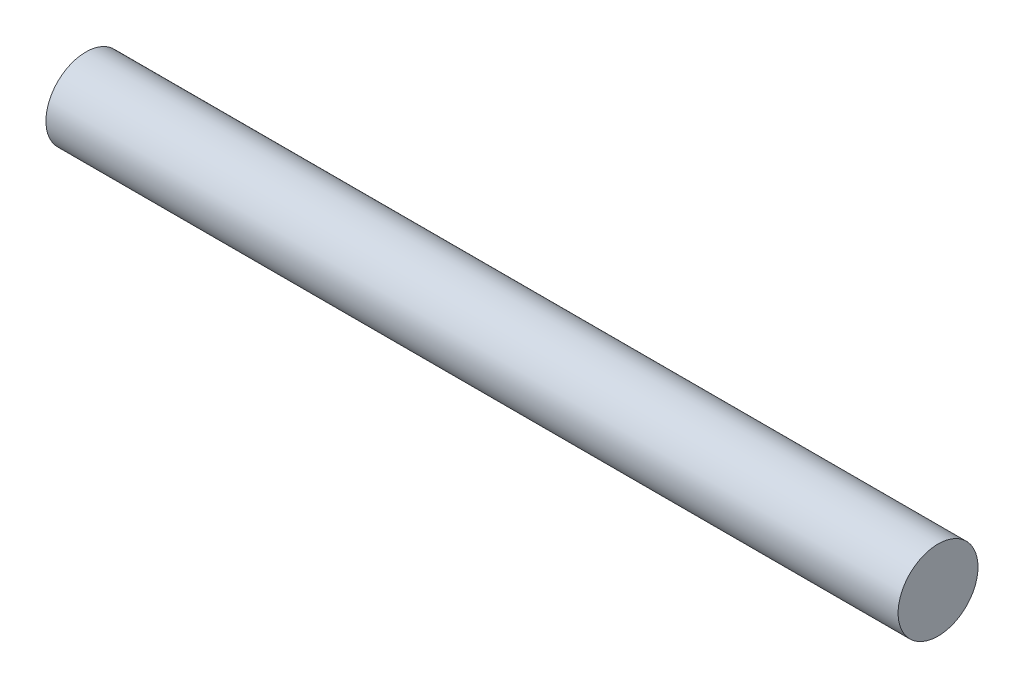
ISO-10303-21;
HEADER;
FILE_DESCRIPTION(('STEP AP214'),'2;1');
FILE_NAME('part.step','',(''),(''),'','','');
FILE_SCHEMA(('AUTOMOTIVE_DESIGN { 1 0 10303 214 1 1 1 1 }'));
ENDSEC;
DATA;
#1=APPLICATION_CONTEXT('core data for automotive mechanical design processes');
#2=APPLICATION_PROTOCOL_DEFINITION('international standard','automotive_design',2000,#1);
#3=PRODUCT_CONTEXT('',#1,'mechanical');
#4=PRODUCT('Part','Part','',(#3));
#5=PRODUCT_RELATED_PRODUCT_CATEGORY('part','',(#4));
#6=PRODUCT_DEFINITION_FORMATION('','',#4);
#7=PRODUCT_DEFINITION_CONTEXT('part definition',#1,'design');
#8=PRODUCT_DEFINITION('design','',#6,#7);
#9=PRODUCT_DEFINITION_SHAPE('','',#8);
#10=(LENGTH_UNIT() NAMED_UNIT(*) SI_UNIT(.MILLI.,.METRE.));
#11=(NAMED_UNIT(*) PLANE_ANGLE_UNIT() SI_UNIT($,.RADIAN.));
#12=(NAMED_UNIT(*) SI_UNIT($,.STERADIAN.) SOLID_ANGLE_UNIT());
#13=UNCERTAINTY_MEASURE_WITH_UNIT(LENGTH_MEASURE(1.E-05),#10,'distance_accuracy_value','');
#14=(GEOMETRIC_REPRESENTATION_CONTEXT(3) GLOBAL_UNCERTAINTY_ASSIGNED_CONTEXT((#13)) GLOBAL_UNIT_ASSIGNED_CONTEXT((#10,
#11,#12)) REPRESENTATION_CONTEXT('',''));
#15=CARTESIAN_POINT('',(0.,0.,0.));
#16=DIRECTION('',(0.,0.,1.));
#17=DIRECTION('',(1.,0.,0.));
#18=AXIS2_PLACEMENT_3D('',#15,#16,#17);
#19=CARTESIAN_POINT('',(80.,0.,0.));
#20=DIRECTION('',(-1.,0.,0.));
#21=DIRECTION('',(0.,0.,1.));
#22=AXIS2_PLACEMENT_3D('',#19,#20,#21);
#23=CYLINDRICAL_SURFACE('',#22,7.5);
#24=CARTESIAN_POINT('',(80.,0.,0.));
#25=DIRECTION('',(1.,0.,0.));
#26=DIRECTION('',(0.,0.,-1.));
#27=AXIS2_PLACEMENT_3D('',#24,#25,#26);
#28=CIRCLE('',#27,7.5);
#29=CARTESIAN_POINT('',(80.,0.,-7.5));
#30=VERTEX_POINT('',#29);
#31=EDGE_CURVE('E12',#30,#30,#28,.T.);
#32=ORIENTED_EDGE('',*,*,#31,.F.);
#33=EDGE_LOOP('',(#32));
#34=FACE_BOUND('',#33,.T.);
#35=CARTESIAN_POINT('',(-80.,0.,0.));
#36=DIRECTION('',(1.,0.,0.));
#37=DIRECTION('',(0.,0.,-1.));
#38=AXIS2_PLACEMENT_3D('',#35,#36,#37);
#39=CIRCLE('',#38,7.5);
#40=CARTESIAN_POINT('',(-80.,0.,-7.5));
#41=VERTEX_POINT('',#40);
#42=EDGE_CURVE('E47',#41,#41,#39,.T.);
#43=ORIENTED_EDGE('',*,*,#42,.T.);
#44=EDGE_LOOP('',(#43));
#45=FACE_BOUND('',#44,.T.);
#46=ADVANCED_FACE('F44',(#34,#45),#23,.T.);
#47=CARTESIAN_POINT('',(80.,0.,0.));
#48=DIRECTION('',(1.,0.,0.));
#49=DIRECTION('',(0.,0.,-1.));
#50=AXIS2_PLACEMENT_3D('',#47,#48,#49);
#51=PLANE('',#50);
#52=ORIENTED_EDGE('',*,*,#31,.T.);
#53=EDGE_LOOP('',(#52));
#54=FACE_BOUND('',#53,.T.);
#55=ADVANCED_FACE('F59',(#54),#51,.T.);
#56=CARTESIAN_POINT('',(-80.,0.,0.));
#57=DIRECTION('',(1.,0.,0.));
#58=DIRECTION('',(0.,0.,-1.));
#59=AXIS2_PLACEMENT_3D('',#56,#57,#58);
#60=PLANE('',#59);
#61=ORIENTED_EDGE('',*,*,#42,.F.);
#62=EDGE_LOOP('',(#61));
#63=FACE_BOUND('',#62,.T.);
#64=ADVANCED_FACE('F57',(#63),#60,.F.);
#65=CLOSED_SHELL('',(#46,#55,#64));
#66=MANIFOLD_SOLID_BREP('B2',#65);
#67=ADVANCED_BREP_SHAPE_REPRESENTATION('',(#18,#66),#14);
#68=SHAPE_DEFINITION_REPRESENTATION(#9,#67);
ENDSEC;
END-ISO-10303-21;
